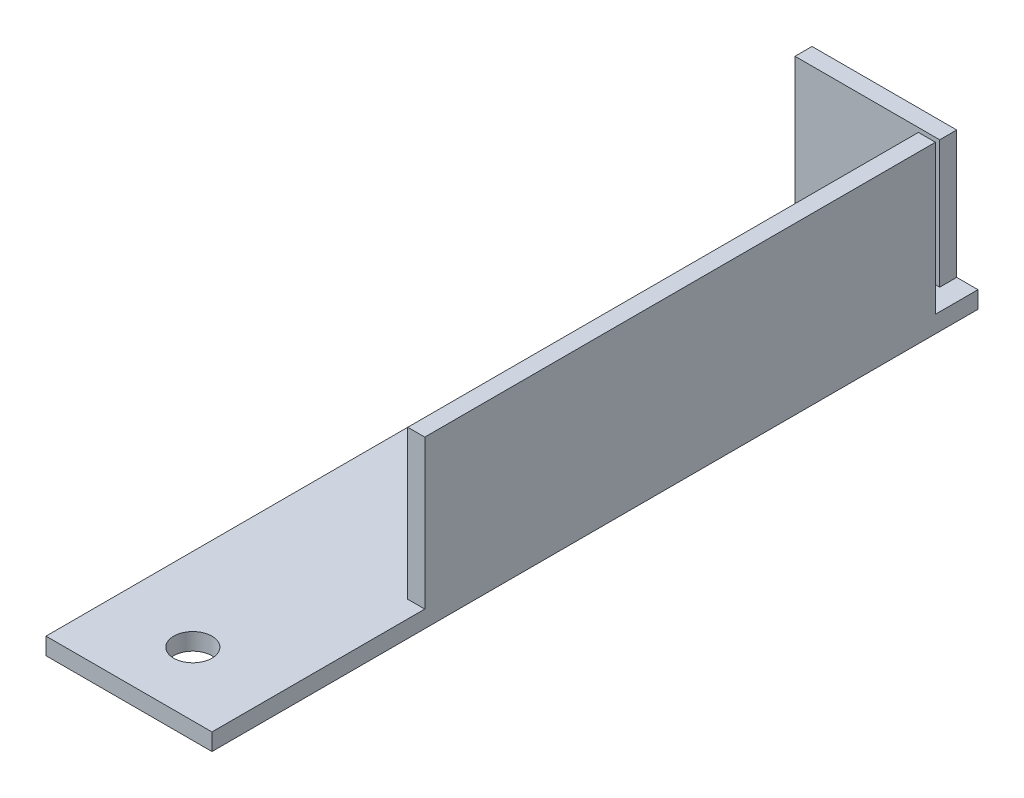
ISO-10303-21;
HEADER;
FILE_DESCRIPTION(('STEP AP214'),'2;1');
FILE_NAME('part.step','',(''),(''),'','','');
FILE_SCHEMA(('AUTOMOTIVE_DESIGN { 1 0 10303 214 1 1 1 1 }'));
ENDSEC;
DATA;
#1=APPLICATION_CONTEXT('core data for automotive mechanical design processes');
#2=APPLICATION_PROTOCOL_DEFINITION('international standard','automotive_design',2000,#1);
#3=PRODUCT_CONTEXT('',#1,'mechanical');
#4=PRODUCT('Part','Part','',(#3));
#5=PRODUCT_RELATED_PRODUCT_CATEGORY('part','',(#4));
#6=PRODUCT_DEFINITION_FORMATION('','',#4);
#7=PRODUCT_DEFINITION_CONTEXT('part definition',#1,'design');
#8=PRODUCT_DEFINITION('design','',#6,#7);
#9=PRODUCT_DEFINITION_SHAPE('','',#8);
#10=(LENGTH_UNIT() NAMED_UNIT(*) SI_UNIT(.MILLI.,.METRE.));
#11=(NAMED_UNIT(*) PLANE_ANGLE_UNIT() SI_UNIT($,.RADIAN.));
#12=(NAMED_UNIT(*) SI_UNIT($,.STERADIAN.) SOLID_ANGLE_UNIT());
#13=UNCERTAINTY_MEASURE_WITH_UNIT(LENGTH_MEASURE(1.E-05),#10,'distance_accuracy_value','');
#14=(GEOMETRIC_REPRESENTATION_CONTEXT(3) GLOBAL_UNCERTAINTY_ASSIGNED_CONTEXT((#13)) GLOBAL_UNIT_ASSIGNED_CONTEXT((#10,
#11,#12)) REPRESENTATION_CONTEXT('',''));
#15=CARTESIAN_POINT('',(0.,0.,0.));
#16=DIRECTION('',(0.,0.,1.));
#17=DIRECTION('',(1.,0.,0.));
#18=AXIS2_PLACEMENT_3D('',#15,#16,#17);
#19=CARTESIAN_POINT('',(-2.,2.,90.));
#20=DIRECTION('',(0.,-1.,0.));
#21=DIRECTION('',(0.,0.,-1.));
#22=AXIS2_PLACEMENT_3D('',#19,#20,#21);
#23=PLANE('',#22);
#24=CARTESIAN_POINT('',(-9.75,2.,82.5));
#25=DIRECTION('',(0.,-1.,0.));
#26=DIRECTION('',(0.,0.,1.));
#27=AXIS2_PLACEMENT_3D('',#24,#25,#26);
#28=CIRCLE('',#27,2.25);
#29=CARTESIAN_POINT('',(-9.75,2.,84.75));
#30=VERTEX_POINT('',#29);
#31=EDGE_CURVE('E229',#30,#30,#28,.T.);
#32=ORIENTED_EDGE('',*,*,#31,.T.);
#33=EDGE_LOOP('',(#32));
#34=FACE_BOUND('',#33,.T.);
#35=DIRECTION('',(0.,0.,1.));
#36=VECTOR('',#35,1.);
#37=CARTESIAN_POINT('',(-2.5,2.,0.));
#38=LINE('',#37,#36);
#39=CARTESIAN_POINT('',(-2.5,2.,0.));
#40=VERTEX_POINT('',#39);
#41=CARTESIAN_POINT('',(-2.5,2.,2.));
#42=VERTEX_POINT('',#41);
#43=EDGE_CURVE('E170',#40,#42,#38,.T.);
#44=ORIENTED_EDGE('',*,*,#43,.T.);
#45=DIRECTION('',(-1.,0.,0.));
#46=VECTOR('',#45,1.);
#47=CARTESIAN_POINT('',(-19.5,2.,2.));
#48=LINE('',#47,#46);
#49=CARTESIAN_POINT('',(-19.5,2.,2.00000000000003));
#50=VERTEX_POINT('',#49);
#51=EDGE_CURVE('E133',#42,#50,#48,.T.);
#52=ORIENTED_EDGE('',*,*,#51,.T.);
#53=DIRECTION('',(0.,0.,-1.));
#54=VECTOR('',#53,1.);
#55=CARTESIAN_POINT('',(-19.5,2.,90.));
#56=LINE('',#55,#54);
#57=CARTESIAN_POINT('',(-19.5,2.,90.));
#58=VERTEX_POINT('',#57);
#59=EDGE_CURVE('E43',#58,#50,#56,.T.);
#60=ORIENTED_EDGE('',*,*,#59,.F.);
#61=DIRECTION('',(1.,0.,0.));
#62=VECTOR('',#61,1.);
#63=CARTESIAN_POINT('',(-2.,2.,90.));
#64=LINE('',#63,#62);
#65=CARTESIAN_POINT('',(0.,2.,90.));
#66=VERTEX_POINT('',#65);
#67=EDGE_CURVE('E208',#58,#66,#64,.T.);
#68=ORIENTED_EDGE('',*,*,#67,.T.);
#69=DIRECTION('',(0.,0.,-1.));
#70=VECTOR('',#69,1.);
#71=CARTESIAN_POINT('',(0.,2.,90.));
#72=LINE('',#71,#70);
#73=CARTESIAN_POINT('',(0.,2.,65.));
#74=VERTEX_POINT('',#73);
#75=EDGE_CURVE('E182',#66,#74,#72,.T.);
#76=ORIENTED_EDGE('',*,*,#75,.T.);
#77=DIRECTION('',(-1.,0.,0.));
#78=VECTOR('',#77,1.);
#79=CARTESIAN_POINT('',(0.,2.,65.));
#80=LINE('',#79,#78);
#81=CARTESIAN_POINT('',(-2.,2.,65.));
#82=VERTEX_POINT('',#81);
#83=EDGE_CURVE('E188',#74,#82,#80,.T.);
#84=ORIENTED_EDGE('',*,*,#83,.T.);
#85=DIRECTION('',(0.,0.,-1.));
#86=VECTOR('',#85,1.);
#87=CARTESIAN_POINT('',(-2.,2.,90.));
#88=LINE('',#87,#86);
#89=CARTESIAN_POINT('',(-2.,2.,5.));
#90=VERTEX_POINT('',#89);
#91=EDGE_CURVE('E160',#82,#90,#88,.T.);
#92=ORIENTED_EDGE('',*,*,#91,.T.);
#93=DIRECTION('',(-1.,0.,0.));
#94=VECTOR('',#93,1.);
#95=CARTESIAN_POINT('',(0.,2.,5.));
#96=LINE('',#95,#94);
#97=CARTESIAN_POINT('',(0.,2.,5.));
#98=VERTEX_POINT('',#97);
#99=EDGE_CURVE('E191',#98,#90,#96,.T.);
#100=ORIENTED_EDGE('',*,*,#99,.F.);
#101=DIRECTION('',(0.,0.,-1.));
#102=VECTOR('',#101,1.);
#103=CARTESIAN_POINT('',(0.,2.,0.));
#104=LINE('',#103,#102);
#105=CARTESIAN_POINT('',(0.,2.,0.));
#106=VERTEX_POINT('',#105);
#107=EDGE_CURVE('E197',#98,#106,#104,.T.);
#108=ORIENTED_EDGE('',*,*,#107,.T.);
#109=DIRECTION('',(1.,0.,0.));
#110=VECTOR('',#109,1.);
#111=CARTESIAN_POINT('',(-2.,2.,0.));
#112=LINE('',#111,#110);
#113=EDGE_CURVE('E139',#40,#106,#112,.T.);
#114=ORIENTED_EDGE('',*,*,#113,.F.);
#115=EDGE_LOOP('',(#44,#52,#60,#68,#76,#84,#92,#100,#108,#114));
#116=FACE_BOUND('',#115,.T.);
#117=ADVANCED_FACE('F35',(#34,#116),#23,.F.);
#118=CARTESIAN_POINT('',(-19.5,0.,90.));
#119=DIRECTION('',(0.,1.,0.));
#120=DIRECTION('',(1.,0.,0.));
#121=AXIS2_PLACEMENT_3D('',#118,#119,#120);
#122=PLANE('',#121);
#123=CARTESIAN_POINT('',(-9.75,0.,82.5));
#124=DIRECTION('',(0.,-1.,0.));
#125=DIRECTION('',(0.,0.,1.));
#126=AXIS2_PLACEMENT_3D('',#123,#124,#125);
#127=CIRCLE('',#126,2.25);
#128=CARTESIAN_POINT('',(-9.75,0.,84.75));
#129=VERTEX_POINT('',#128);
#130=EDGE_CURVE('E172',#129,#129,#127,.T.);
#131=ORIENTED_EDGE('',*,*,#130,.F.);
#132=EDGE_LOOP('',(#131));
#133=FACE_BOUND('',#132,.T.);
#134=DIRECTION('',(-1.,0.,0.));
#135=VECTOR('',#134,1.);
#136=CARTESIAN_POINT('',(-19.5,0.,0.));
#137=LINE('',#136,#135);
#138=CARTESIAN_POINT('',(0.,0.,0.));
#139=VERTEX_POINT('',#138);
#140=CARTESIAN_POINT('',(-19.5,0.,0.));
#141=VERTEX_POINT('',#140);
#142=EDGE_CURVE('E138',#139,#141,#137,.T.);
#143=ORIENTED_EDGE('',*,*,#142,.F.);
#144=DIRECTION('',(0.,0.,-1.));
#145=VECTOR('',#144,1.);
#146=CARTESIAN_POINT('',(0.,0.,90.));
#147=LINE('',#146,#145);
#148=CARTESIAN_POINT('',(0.,0.,90.));
#149=VERTEX_POINT('',#148);
#150=EDGE_CURVE('E150',#149,#139,#147,.T.);
#151=ORIENTED_EDGE('',*,*,#150,.F.);
#152=DIRECTION('',(-1.,0.,0.));
#153=VECTOR('',#152,1.);
#154=CARTESIAN_POINT('',(-19.5,0.,90.));
#155=LINE('',#154,#153);
#156=CARTESIAN_POINT('',(-19.5,0.,90.));
#157=VERTEX_POINT('',#156);
#158=EDGE_CURVE('E149',#149,#157,#155,.T.);
#159=ORIENTED_EDGE('',*,*,#158,.T.);
#160=DIRECTION('',(0.,0.,-1.));
#161=VECTOR('',#160,1.);
#162=CARTESIAN_POINT('',(-19.5,0.,90.));
#163=LINE('',#162,#161);
#164=EDGE_CURVE('E11',#157,#141,#163,.T.);
#165=ORIENTED_EDGE('',*,*,#164,.T.);
#166=EDGE_LOOP('',(#143,#151,#159,#165));
#167=FACE_BOUND('',#166,.T.);
#168=ADVANCED_FACE('F37',(#133,#167),#122,.F.);
#169=CARTESIAN_POINT('',(-19.5,2.,90.));
#170=DIRECTION('',(1.,0.,0.));
#171=DIRECTION('',(0.,0.,1.));
#172=AXIS2_PLACEMENT_3D('',#169,#170,#171);
#173=PLANE('',#172);
#174=DIRECTION('',(0.,1.,0.));
#175=VECTOR('',#174,1.);
#176=CARTESIAN_POINT('',(-19.5,2.,0.));
#177=LINE('',#176,#175);
#178=CARTESIAN_POINT('',(-19.5,17.,0.));
#179=VERTEX_POINT('',#178);
#180=EDGE_CURVE('E132',#141,#179,#177,.T.);
#181=ORIENTED_EDGE('',*,*,#180,.F.);
#182=ORIENTED_EDGE('',*,*,#164,.F.);
#183=DIRECTION('',(0.,1.,0.));
#184=VECTOR('',#183,1.);
#185=CARTESIAN_POINT('',(-19.5,2.,90.));
#186=LINE('',#185,#184);
#187=EDGE_CURVE('E164',#157,#58,#186,.T.);
#188=ORIENTED_EDGE('',*,*,#187,.T.);
#189=ORIENTED_EDGE('',*,*,#59,.T.);
#190=DIRECTION('',(0.,-1.,0.));
#191=VECTOR('',#190,1.);
#192=CARTESIAN_POINT('',(-19.5,17.,2.));
#193=LINE('',#192,#191);
#194=CARTESIAN_POINT('',(-19.5,17.,2.));
#195=VERTEX_POINT('',#194);
#196=EDGE_CURVE('E57',#195,#50,#193,.T.);
#197=ORIENTED_EDGE('',*,*,#196,.F.);
#198=DIRECTION('',(0.,0.,-1.));
#199=VECTOR('',#198,1.);
#200=CARTESIAN_POINT('',(-19.5,17.,0.));
#201=LINE('',#200,#199);
#202=EDGE_CURVE('E123',#195,#179,#201,.T.);
#203=ORIENTED_EDGE('',*,*,#202,.T.);
#204=EDGE_LOOP('',(#181,#182,#188,#189,#197,#203));
#205=FACE_BOUND('',#204,.T.);
#206=ADVANCED_FACE('F130',(#205),#173,.F.);
#207=CARTESIAN_POINT('',(-2.,19.5,90.));
#208=DIRECTION('',(1.,0.,0.));
#209=DIRECTION('',(0.,-1.,0.));
#210=AXIS2_PLACEMENT_3D('',#207,#208,#209);
#211=PLANE('',#210);
#212=DIRECTION('',(0.,0.,-1.));
#213=VECTOR('',#212,1.);
#214=CARTESIAN_POINT('',(-2.,19.5,90.));
#215=LINE('',#214,#213);
#216=CARTESIAN_POINT('',(-2.,19.5,65.));
#217=VERTEX_POINT('',#216);
#218=CARTESIAN_POINT('',(-2.,19.5,5.));
#219=VERTEX_POINT('',#218);
#220=EDGE_CURVE('E157',#217,#219,#215,.T.);
#221=ORIENTED_EDGE('',*,*,#220,.T.);
#222=DIRECTION('',(0.,-1.,0.));
#223=VECTOR('',#222,1.);
#224=CARTESIAN_POINT('',(-2.,19.5,5.));
#225=LINE('',#224,#223);
#226=EDGE_CURVE('E181',#219,#90,#225,.T.);
#227=ORIENTED_EDGE('',*,*,#226,.T.);
#228=ORIENTED_EDGE('',*,*,#91,.F.);
#229=DIRECTION('',(0.,1.,0.));
#230=VECTOR('',#229,1.);
#231=CARTESIAN_POINT('',(-2.,19.5,65.));
#232=LINE('',#231,#230);
#233=EDGE_CURVE('E186',#82,#217,#232,.T.);
#234=ORIENTED_EDGE('',*,*,#233,.T.);
#235=EDGE_LOOP('',(#221,#227,#228,#234));
#236=FACE_BOUND('',#235,.T.);
#237=ADVANCED_FACE('F223',(#236),#211,.F.);
#238=CARTESIAN_POINT('',(0.,19.5,90.));
#239=DIRECTION('',(0.,-1.,0.));
#240=DIRECTION('',(0.,0.,-1.));
#241=AXIS2_PLACEMENT_3D('',#238,#239,#240);
#242=PLANE('',#241);
#243=DIRECTION('',(0.,0.,-1.));
#244=VECTOR('',#243,1.);
#245=CARTESIAN_POINT('',(0.,19.5,90.));
#246=LINE('',#245,#244);
#247=CARTESIAN_POINT('',(0.,19.5,65.));
#248=VERTEX_POINT('',#247);
#249=CARTESIAN_POINT('',(0.,19.5,5.));
#250=VERTEX_POINT('',#249);
#251=EDGE_CURVE('E153',#248,#250,#246,.T.);
#252=ORIENTED_EDGE('',*,*,#251,.T.);
#253=DIRECTION('',(-1.,0.,0.));
#254=VECTOR('',#253,1.);
#255=CARTESIAN_POINT('',(0.,19.5,5.));
#256=LINE('',#255,#254);
#257=EDGE_CURVE('E200',#250,#219,#256,.T.);
#258=ORIENTED_EDGE('',*,*,#257,.T.);
#259=ORIENTED_EDGE('',*,*,#220,.F.);
#260=DIRECTION('',(-1.,0.,0.));
#261=VECTOR('',#260,1.);
#262=CARTESIAN_POINT('',(0.,19.5,65.));
#263=LINE('',#262,#261);
#264=EDGE_CURVE('E144',#248,#217,#263,.T.);
#265=ORIENTED_EDGE('',*,*,#264,.F.);
#266=EDGE_LOOP('',(#252,#258,#259,#265));
#267=FACE_BOUND('',#266,.T.);
#268=ADVANCED_FACE('F246',(#267),#242,.F.);
#269=CARTESIAN_POINT('',(0.,0.,90.));
#270=DIRECTION('',(-1.,0.,0.));
#271=DIRECTION('',(0.,0.,-1.));
#272=AXIS2_PLACEMENT_3D('',#269,#270,#271);
#273=PLANE('',#272);
#274=ORIENTED_EDGE('',*,*,#75,.F.);
#275=DIRECTION('',(0.,-1.,0.));
#276=VECTOR('',#275,1.);
#277=CARTESIAN_POINT('',(0.,0.,90.));
#278=LINE('',#277,#276);
#279=EDGE_CURVE('E154',#66,#149,#278,.T.);
#280=ORIENTED_EDGE('',*,*,#279,.T.);
#281=ORIENTED_EDGE('',*,*,#150,.T.);
#282=DIRECTION('',(0.,-1.,0.));
#283=VECTOR('',#282,1.);
#284=CARTESIAN_POINT('',(0.,0.,0.));
#285=LINE('',#284,#283);
#286=EDGE_CURVE('E142',#106,#139,#285,.T.);
#287=ORIENTED_EDGE('',*,*,#286,.F.);
#288=ORIENTED_EDGE('',*,*,#107,.F.);
#289=DIRECTION('',(0.,-1.,0.));
#290=VECTOR('',#289,1.);
#291=CARTESIAN_POINT('',(0.,19.5,5.));
#292=LINE('',#291,#290);
#293=EDGE_CURVE('E195',#250,#98,#292,.T.);
#294=ORIENTED_EDGE('',*,*,#293,.F.);
#295=ORIENTED_EDGE('',*,*,#251,.F.);
#296=DIRECTION('',(0.,1.,0.));
#297=VECTOR('',#296,1.);
#298=CARTESIAN_POINT('',(0.,19.5,65.));
#299=LINE('',#298,#297);
#300=EDGE_CURVE('E185',#74,#248,#299,.T.);
#301=ORIENTED_EDGE('',*,*,#300,.F.);
#302=EDGE_LOOP('',(#274,#280,#281,#287,#288,#294,#295,#301));
#303=FACE_BOUND('',#302,.T.);
#304=ADVANCED_FACE('F212',(#303),#273,.F.);
#305=CARTESIAN_POINT('',(0.,0.,90.));
#306=DIRECTION('',(0.,0.,-1.));
#307=DIRECTION('',(1.,0.,0.));
#308=AXIS2_PLACEMENT_3D('',#305,#306,#307);
#309=PLANE('',#308);
#310=ORIENTED_EDGE('',*,*,#67,.F.);
#311=ORIENTED_EDGE('',*,*,#187,.F.);
#312=ORIENTED_EDGE('',*,*,#158,.F.);
#313=ORIENTED_EDGE('',*,*,#279,.F.);
#314=EDGE_LOOP('',(#310,#311,#312,#313));
#315=FACE_BOUND('',#314,.T.);
#316=ADVANCED_FACE('F215',(#315),#309,.F.);
#317=CARTESIAN_POINT('',(0.,0.,0.));
#318=DIRECTION('',(0.,0.,-1.));
#319=DIRECTION('',(1.,0.,0.));
#320=AXIS2_PLACEMENT_3D('',#317,#318,#319);
#321=PLANE('',#320);
#322=ORIENTED_EDGE('',*,*,#286,.T.);
#323=ORIENTED_EDGE('',*,*,#142,.T.);
#324=ORIENTED_EDGE('',*,*,#180,.T.);
#325=DIRECTION('',(1.,0.,0.));
#326=VECTOR('',#325,1.);
#327=CARTESIAN_POINT('',(-19.5,17.,0.));
#328=LINE('',#327,#326);
#329=CARTESIAN_POINT('',(-2.5,17.,0.));
#330=VERTEX_POINT('',#329);
#331=EDGE_CURVE('E120',#179,#330,#328,.T.);
#332=ORIENTED_EDGE('',*,*,#331,.T.);
#333=DIRECTION('',(0.,-1.,0.));
#334=VECTOR('',#333,1.);
#335=CARTESIAN_POINT('',(-2.5,17.,0.));
#336=LINE('',#335,#334);
#337=EDGE_CURVE('E179',#330,#40,#336,.T.);
#338=ORIENTED_EDGE('',*,*,#337,.T.);
#339=ORIENTED_EDGE('',*,*,#113,.T.);
#340=EDGE_LOOP('',(#322,#323,#324,#332,#338,#339));
#341=FACE_BOUND('',#340,.T.);
#342=ADVANCED_FACE('F136',(#341),#321,.T.);
#343=CARTESIAN_POINT('',(0.,19.5,5.));
#344=DIRECTION('',(0.,0.,1.));
#345=DIRECTION('',(0.,-1.,0.));
#346=AXIS2_PLACEMENT_3D('',#343,#344,#345);
#347=PLANE('',#346);
#348=ORIENTED_EDGE('',*,*,#226,.F.);
#349=ORIENTED_EDGE('',*,*,#257,.F.);
#350=ORIENTED_EDGE('',*,*,#293,.T.);
#351=ORIENTED_EDGE('',*,*,#99,.T.);
#352=EDGE_LOOP('',(#348,#349,#350,#351));
#353=FACE_BOUND('',#352,.T.);
#354=ADVANCED_FACE('F242',(#353),#347,.F.);
#355=CARTESIAN_POINT('',(0.,19.5,65.));
#356=DIRECTION('',(0.,0.,-1.));
#357=DIRECTION('',(1.,0.,0.));
#358=AXIS2_PLACEMENT_3D('',#355,#356,#357);
#359=PLANE('',#358);
#360=ORIENTED_EDGE('',*,*,#233,.F.);
#361=ORIENTED_EDGE('',*,*,#83,.F.);
#362=ORIENTED_EDGE('',*,*,#300,.T.);
#363=ORIENTED_EDGE('',*,*,#264,.T.);
#364=EDGE_LOOP('',(#360,#361,#362,#363));
#365=FACE_BOUND('',#364,.T.);
#366=ADVANCED_FACE('F248',(#365),#359,.F.);
#367=CARTESIAN_POINT('',(-2.5,17.,0.));
#368=DIRECTION('',(-1.,0.,0.));
#369=DIRECTION('',(0.,0.,-1.));
#370=AXIS2_PLACEMENT_3D('',#367,#368,#369);
#371=PLANE('',#370);
#372=ORIENTED_EDGE('',*,*,#43,.F.);
#373=ORIENTED_EDGE('',*,*,#337,.F.);
#374=DIRECTION('',(0.,0.,1.));
#375=VECTOR('',#374,1.);
#376=CARTESIAN_POINT('',(-2.5,17.,0.));
#377=LINE('',#376,#375);
#378=CARTESIAN_POINT('',(-2.5,17.,2.));
#379=VERTEX_POINT('',#378);
#380=EDGE_CURVE('E124',#330,#379,#377,.T.);
#381=ORIENTED_EDGE('',*,*,#380,.T.);
#382=DIRECTION('',(0.,-1.,0.));
#383=VECTOR('',#382,1.);
#384=CARTESIAN_POINT('',(-2.5,17.,2.));
#385=LINE('',#384,#383);
#386=EDGE_CURVE('E50',#379,#42,#385,.T.);
#387=ORIENTED_EDGE('',*,*,#386,.T.);
#388=EDGE_LOOP('',(#372,#373,#381,#387));
#389=FACE_BOUND('',#388,.T.);
#390=ADVANCED_FACE('F235',(#389),#371,.F.);
#391=CARTESIAN_POINT('',(-19.5,17.,2.));
#392=DIRECTION('',(0.,0.,-1.));
#393=DIRECTION('',(1.,0.,0.));
#394=AXIS2_PLACEMENT_3D('',#391,#392,#393);
#395=PLANE('',#394);
#396=ORIENTED_EDGE('',*,*,#51,.F.);
#397=ORIENTED_EDGE('',*,*,#386,.F.);
#398=DIRECTION('',(-1.,0.,0.));
#399=VECTOR('',#398,1.);
#400=CARTESIAN_POINT('',(-19.5,17.,2.));
#401=LINE('',#400,#399);
#402=EDGE_CURVE('E177',#379,#195,#401,.T.);
#403=ORIENTED_EDGE('',*,*,#402,.T.);
#404=ORIENTED_EDGE('',*,*,#196,.T.);
#405=EDGE_LOOP('',(#396,#397,#403,#404));
#406=FACE_BOUND('',#405,.T.);
#407=ADVANCED_FACE('F234',(#406),#395,.F.);
#408=CARTESIAN_POINT('',(0.,17.,0.));
#409=DIRECTION('',(0.,-1.,0.));
#410=DIRECTION('',(0.,0.,-1.));
#411=AXIS2_PLACEMENT_3D('',#408,#409,#410);
#412=PLANE('',#411);
#413=ORIENTED_EDGE('',*,*,#202,.F.);
#414=ORIENTED_EDGE('',*,*,#402,.F.);
#415=ORIENTED_EDGE('',*,*,#380,.F.);
#416=ORIENTED_EDGE('',*,*,#331,.F.);
#417=EDGE_LOOP('',(#413,#414,#415,#416));
#418=FACE_BOUND('',#417,.T.);
#419=ADVANCED_FACE('F122',(#418),#412,.F.);
#420=CARTESIAN_POINT('',(-9.75,0.,82.5));
#421=DIRECTION('',(0.,1.,0.));
#422=DIRECTION('',(0.,0.,1.));
#423=AXIS2_PLACEMENT_3D('',#420,#421,#422);
#424=CYLINDRICAL_SURFACE('',#423,2.25);
#425=ORIENTED_EDGE('',*,*,#130,.T.);
#426=EDGE_LOOP('',(#425));
#427=FACE_BOUND('',#426,.T.);
#428=ORIENTED_EDGE('',*,*,#31,.F.);
#429=EDGE_LOOP('',(#428));
#430=FACE_BOUND('',#429,.T.);
#431=ADVANCED_FACE('F275',(#427,#430),#424,.F.);
#432=CLOSED_SHELL('',(#117,#168,#206,#237,#268,#304,#316,#342,#354,#366,#390,#407,#419,#431));
#433=MANIFOLD_SOLID_BREP('B2',#432);
#434=ADVANCED_BREP_SHAPE_REPRESENTATION('',(#18,#433),#14);
#435=SHAPE_DEFINITION_REPRESENTATION(#9,#434);
ENDSEC;
END-ISO-10303-21;
